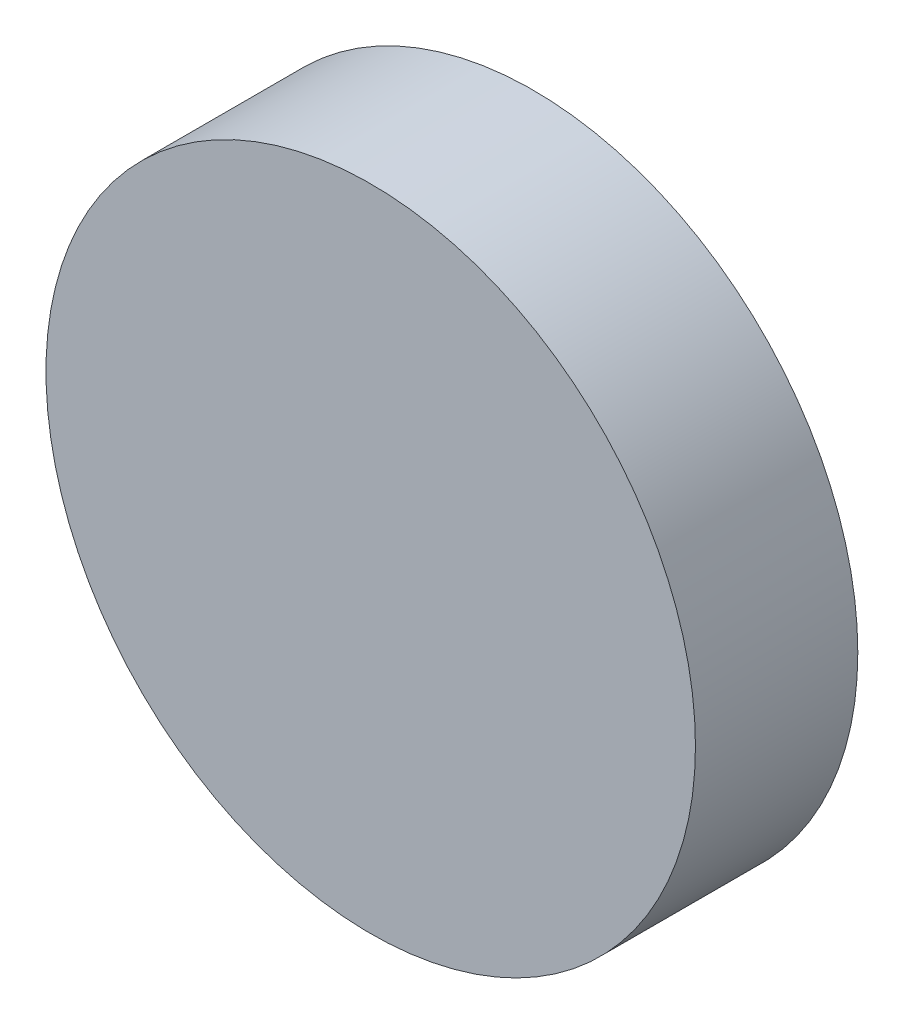
ISO-10303-21;
HEADER;
FILE_DESCRIPTION(('STEP AP214'),'2;1');
FILE_NAME('part.step','',(''),(''),'','','');
FILE_SCHEMA(('AUTOMOTIVE_DESIGN { 1 0 10303 214 1 1 1 1 }'));
ENDSEC;
DATA;
#1=APPLICATION_CONTEXT('core data for automotive mechanical design processes');
#2=APPLICATION_PROTOCOL_DEFINITION('international standard','automotive_design',2000,#1);
#3=PRODUCT_CONTEXT('',#1,'mechanical');
#4=PRODUCT('Part','Part','',(#3));
#5=PRODUCT_RELATED_PRODUCT_CATEGORY('part','',(#4));
#6=PRODUCT_DEFINITION_FORMATION('','',#4);
#7=PRODUCT_DEFINITION_CONTEXT('part definition',#1,'design');
#8=PRODUCT_DEFINITION('design','',#6,#7);
#9=PRODUCT_DEFINITION_SHAPE('','',#8);
#10=(LENGTH_UNIT() NAMED_UNIT(*) SI_UNIT(.MILLI.,.METRE.));
#11=(NAMED_UNIT(*) PLANE_ANGLE_UNIT() SI_UNIT($,.RADIAN.));
#12=(NAMED_UNIT(*) SI_UNIT($,.STERADIAN.) SOLID_ANGLE_UNIT());
#13=UNCERTAINTY_MEASURE_WITH_UNIT(LENGTH_MEASURE(1.E-05),#10,'distance_accuracy_value','');
#14=(GEOMETRIC_REPRESENTATION_CONTEXT(3) GLOBAL_UNCERTAINTY_ASSIGNED_CONTEXT((#13)) GLOBAL_UNIT_ASSIGNED_CONTEXT((#10,
#11,#12)) REPRESENTATION_CONTEXT('',''));
#15=CARTESIAN_POINT('',(0.,0.,0.));
#16=DIRECTION('',(0.,0.,1.));
#17=DIRECTION('',(1.,0.,0.));
#18=AXIS2_PLACEMENT_3D('',#15,#16,#17);
#19=CARTESIAN_POINT('',(0.,0.,5.));
#20=DIRECTION('',(0.,0.,-1.));
#21=DIRECTION('',(-1.,0.,0.));
#22=AXIS2_PLACEMENT_3D('',#19,#20,#21);
#23=CYLINDRICAL_SURFACE('',#22,10.);
#24=CARTESIAN_POINT('',(0.,0.,5.));
#25=DIRECTION('',(0.,0.,1.));
#26=DIRECTION('',(1.,0.,0.));
#27=AXIS2_PLACEMENT_3D('',#24,#25,#26);
#28=CIRCLE('',#27,10.);
#29=CARTESIAN_POINT('',(10.,0.,5.));
#30=VERTEX_POINT('',#29);
#31=EDGE_CURVE('E44',#30,#30,#28,.T.);
#32=ORIENTED_EDGE('',*,*,#31,.F.);
#33=EDGE_LOOP('',(#32));
#34=FACE_BOUND('',#33,.T.);
#35=CARTESIAN_POINT('',(0.,0.,0.));
#36=DIRECTION('',(0.,0.,1.));
#37=DIRECTION('',(1.,0.,0.));
#38=AXIS2_PLACEMENT_3D('',#35,#36,#37);
#39=CIRCLE('',#38,10.);
#40=CARTESIAN_POINT('',(10.,0.,0.));
#41=VERTEX_POINT('',#40);
#42=EDGE_CURVE('E49',#41,#41,#39,.T.);
#43=ORIENTED_EDGE('',*,*,#42,.T.);
#44=EDGE_LOOP('',(#43));
#45=FACE_BOUND('',#44,.T.);
#46=ADVANCED_FACE('F37',(#34,#45),#23,.T.);
#47=CARTESIAN_POINT('',(0.,0.,5.));
#48=DIRECTION('',(0.,0.,1.));
#49=DIRECTION('',(1.,0.,0.));
#50=AXIS2_PLACEMENT_3D('',#47,#48,#49);
#51=PLANE('',#50);
#52=ORIENTED_EDGE('',*,*,#31,.T.);
#53=EDGE_LOOP('',(#52));
#54=FACE_BOUND('',#53,.T.);
#55=ADVANCED_FACE('F72',(#54),#51,.T.);
#56=CARTESIAN_POINT('',(0.,0.,0.));
#57=DIRECTION('',(0.,0.,1.));
#58=DIRECTION('',(1.,0.,0.));
#59=AXIS2_PLACEMENT_3D('',#56,#57,#58);
#60=PLANE('',#59);
#61=CARTESIAN_POINT('',(0.,0.,0.));
#62=DIRECTION('',(0.,0.,1.));
#63=DIRECTION('',(1.,0.,0.));
#64=AXIS2_PLACEMENT_3D('',#61,#62,#63);
#65=CIRCLE('',#64,1.);
#66=CARTESIAN_POINT('',(1.,0.,0.));
#67=VERTEX_POINT('',#66);
#68=EDGE_CURVE('E10',#67,#67,#65,.F.);
#69=ORIENTED_EDGE('',*,*,#68,.F.);
#70=EDGE_LOOP('',(#69));
#71=FACE_BOUND('',#70,.T.);
#72=ORIENTED_EDGE('',*,*,#42,.F.);
#73=EDGE_LOOP('',(#72));
#74=FACE_BOUND('',#73,.T.);
#75=ADVANCED_FACE('F65',(#71,#74),#60,.F.);
#76=CARTESIAN_POINT('',(0.,0.,-5.));
#77=DIRECTION('',(0.,0.,1.));
#78=DIRECTION('',(1.,0.,0.));
#79=AXIS2_PLACEMENT_3D('',#76,#77,#78);
#80=CYLINDRICAL_SURFACE('',#79,1.);
#81=CARTESIAN_POINT('',(0.,0.,-5.));
#82=DIRECTION('',(0.,0.,-1.));
#83=DIRECTION('',(-1.,0.,0.));
#84=AXIS2_PLACEMENT_3D('',#81,#82,#83);
#85=CIRCLE('',#84,1.);
#86=CARTESIAN_POINT('',(-1.,0.,-5.));
#87=VERTEX_POINT('',#86);
#88=EDGE_CURVE('E55',#87,#87,#85,.T.);
#89=ORIENTED_EDGE('',*,*,#88,.F.);
#90=EDGE_LOOP('',(#89));
#91=FACE_BOUND('',#90,.T.);
#92=ORIENTED_EDGE('',*,*,#68,.T.);
#93=EDGE_LOOP('',(#92));
#94=FACE_BOUND('',#93,.T.);
#95=ADVANCED_FACE('F63',(#91,#94),#80,.T.);
#96=CARTESIAN_POINT('',(0.,0.,-5.));
#97=DIRECTION('',(0.,0.,-1.));
#98=DIRECTION('',(-1.,0.,0.));
#99=AXIS2_PLACEMENT_3D('',#96,#97,#98);
#100=PLANE('',#99);
#101=ORIENTED_EDGE('',*,*,#88,.T.);
#102=EDGE_LOOP('',(#101));
#103=FACE_BOUND('',#102,.T.);
#104=ADVANCED_FACE('F61',(#103),#100,.T.);
#105=CLOSED_SHELL('',(#46,#55,#75,#95,#104));
#106=MANIFOLD_SOLID_BREP('B2',#105);
#107=ADVANCED_BREP_SHAPE_REPRESENTATION('',(#18,#106),#14);
#108=SHAPE_DEFINITION_REPRESENTATION(#9,#107);
ENDSEC;
END-ISO-10303-21;
